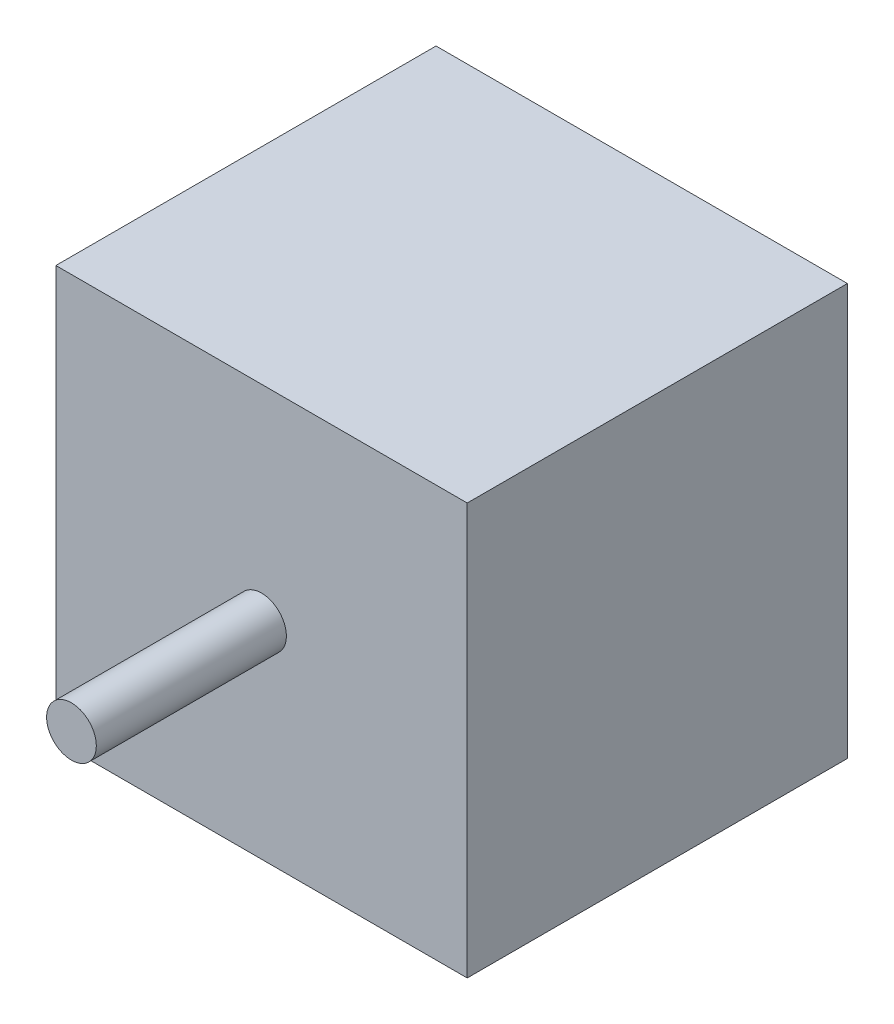
ISO-10303-21;
HEADER;
FILE_DESCRIPTION(('STEP AP214'),'2;1');
FILE_NAME('part.step','',(''),(''),'','','');
FILE_SCHEMA(('AUTOMOTIVE_DESIGN { 1 0 10303 214 1 1 1 1 }'));
ENDSEC;
DATA;
#1=APPLICATION_CONTEXT('core data for automotive mechanical design processes');
#2=APPLICATION_PROTOCOL_DEFINITION('international standard','automotive_design',2000,#1);
#3=PRODUCT_CONTEXT('',#1,'mechanical');
#4=PRODUCT('Part','Part','',(#3));
#5=PRODUCT_RELATED_PRODUCT_CATEGORY('part','',(#4));
#6=PRODUCT_DEFINITION_FORMATION('','',#4);
#7=PRODUCT_DEFINITION_CONTEXT('part definition',#1,'design');
#8=PRODUCT_DEFINITION('design','',#6,#7);
#9=PRODUCT_DEFINITION_SHAPE('','',#8);
#10=(LENGTH_UNIT() NAMED_UNIT(*) SI_UNIT(.MILLI.,.METRE.));
#11=(NAMED_UNIT(*) PLANE_ANGLE_UNIT() SI_UNIT($,.RADIAN.));
#12=(NAMED_UNIT(*) SI_UNIT($,.STERADIAN.) SOLID_ANGLE_UNIT());
#13=UNCERTAINTY_MEASURE_WITH_UNIT(LENGTH_MEASURE(1.E-05),#10,'distance_accuracy_value','');
#14=(GEOMETRIC_REPRESENTATION_CONTEXT(3) GLOBAL_UNCERTAINTY_ASSIGNED_CONTEXT((#13)) GLOBAL_UNIT_ASSIGNED_CONTEXT((#10,
#11,#12)) REPRESENTATION_CONTEXT('',''));
#15=CARTESIAN_POINT('',(0.,0.,0.));
#16=DIRECTION('',(0.,0.,1.));
#17=DIRECTION('',(1.,0.,0.));
#18=AXIS2_PLACEMENT_3D('',#15,#16,#17);
#19=CARTESIAN_POINT('',(0.,0.,39.));
#20=DIRECTION('',(-1.,0.,0.));
#21=DIRECTION('',(0.,-1.,0.));
#22=AXIS2_PLACEMENT_3D('',#19,#20,#21);
#23=PLANE('',#22);
#24=DIRECTION('',(0.,1.,0.));
#25=VECTOR('',#24,1.);
#26=CARTESIAN_POINT('',(0.,0.,0.));
#27=LINE('',#26,#25);
#28=CARTESIAN_POINT('',(0.,-42.2,0.));
#29=VERTEX_POINT('',#28);
#30=CARTESIAN_POINT('',(0.,0.,0.));
#31=VERTEX_POINT('',#30);
#32=EDGE_CURVE('E103',#29,#31,#27,.T.);
#33=ORIENTED_EDGE('',*,*,#32,.T.);
#34=DIRECTION('',(0.,0.,-1.));
#35=VECTOR('',#34,1.);
#36=CARTESIAN_POINT('',(0.,0.,39.));
#37=LINE('',#36,#35);
#38=CARTESIAN_POINT('',(0.,0.,39.));
#39=VERTEX_POINT('',#38);
#40=EDGE_CURVE('E44',#39,#31,#37,.T.);
#41=ORIENTED_EDGE('',*,*,#40,.F.);
#42=DIRECTION('',(0.,1.,0.));
#43=VECTOR('',#42,1.);
#44=CARTESIAN_POINT('',(0.,0.,39.));
#45=LINE('',#44,#43);
#46=CARTESIAN_POINT('',(0.,-42.2,39.));
#47=VERTEX_POINT('',#46);
#48=EDGE_CURVE('E88',#47,#39,#45,.T.);
#49=ORIENTED_EDGE('',*,*,#48,.F.);
#50=DIRECTION('',(0.,0.,-1.));
#51=VECTOR('',#50,1.);
#52=CARTESIAN_POINT('',(0.,-42.2,39.));
#53=LINE('',#52,#51);
#54=EDGE_CURVE('E99',#47,#29,#53,.T.);
#55=ORIENTED_EDGE('',*,*,#54,.T.);
#56=EDGE_LOOP('',(#33,#41,#49,#55));
#57=FACE_BOUND('',#56,.T.);
#58=ADVANCED_FACE('F36',(#57),#23,.F.);
#59=CARTESIAN_POINT('',(0.,0.,39.));
#60=DIRECTION('',(0.,-1.,0.));
#61=DIRECTION('',(0.,0.,-1.));
#62=AXIS2_PLACEMENT_3D('',#59,#60,#61);
#63=PLANE('',#62);
#64=DIRECTION('',(-1.,0.,0.));
#65=VECTOR('',#64,1.);
#66=CARTESIAN_POINT('',(0.,0.,0.));
#67=LINE('',#66,#65);
#68=CARTESIAN_POINT('',(-42.2,0.,0.));
#69=VERTEX_POINT('',#68);
#70=EDGE_CURVE('E94',#31,#69,#67,.T.);
#71=ORIENTED_EDGE('',*,*,#70,.T.);
#72=DIRECTION('',(0.,0.,-1.));
#73=VECTOR('',#72,1.);
#74=CARTESIAN_POINT('',(-42.2,0.,39.));
#75=LINE('',#74,#73);
#76=CARTESIAN_POINT('',(-42.2,0.,39.));
#77=VERTEX_POINT('',#76);
#78=EDGE_CURVE('E92',#77,#69,#75,.T.);
#79=ORIENTED_EDGE('',*,*,#78,.F.);
#80=DIRECTION('',(-1.,0.,0.));
#81=VECTOR('',#80,1.);
#82=CARTESIAN_POINT('',(0.,0.,39.));
#83=LINE('',#82,#81);
#84=EDGE_CURVE('E83',#39,#77,#83,.T.);
#85=ORIENTED_EDGE('',*,*,#84,.F.);
#86=ORIENTED_EDGE('',*,*,#40,.T.);
#87=EDGE_LOOP('',(#71,#79,#85,#86));
#88=FACE_BOUND('',#87,.T.);
#89=ADVANCED_FACE('F93',(#88),#63,.F.);
#90=CARTESIAN_POINT('',(-42.2,0.,39.));
#91=DIRECTION('',(1.,0.,0.));
#92=DIRECTION('',(0.,1.,0.));
#93=AXIS2_PLACEMENT_3D('',#90,#91,#92);
#94=PLANE('',#93);
#95=DIRECTION('',(0.,-1.,0.));
#96=VECTOR('',#95,1.);
#97=CARTESIAN_POINT('',(-42.2,0.,0.));
#98=LINE('',#97,#96);
#99=CARTESIAN_POINT('',(-42.2,-42.2,0.));
#100=VERTEX_POINT('',#99);
#101=EDGE_CURVE('E69',#69,#100,#98,.T.);
#102=ORIENTED_EDGE('',*,*,#101,.T.);
#103=DIRECTION('',(0.,0.,-1.));
#104=VECTOR('',#103,1.);
#105=CARTESIAN_POINT('',(-42.2,-42.2,39.));
#106=LINE('',#105,#104);
#107=CARTESIAN_POINT('',(-42.2,-42.2,39.));
#108=VERTEX_POINT('',#107);
#109=EDGE_CURVE('E95',#108,#100,#106,.T.);
#110=ORIENTED_EDGE('',*,*,#109,.F.);
#111=DIRECTION('',(0.,-1.,0.));
#112=VECTOR('',#111,1.);
#113=CARTESIAN_POINT('',(-42.2,0.,39.));
#114=LINE('',#113,#112);
#115=EDGE_CURVE('E86',#77,#108,#114,.T.);
#116=ORIENTED_EDGE('',*,*,#115,.F.);
#117=ORIENTED_EDGE('',*,*,#78,.T.);
#118=EDGE_LOOP('',(#102,#110,#116,#117));
#119=FACE_BOUND('',#118,.T.);
#120=ADVANCED_FACE('F97',(#119),#94,.F.);
#121=CARTESIAN_POINT('',(0.,-42.2,39.));
#122=DIRECTION('',(0.,1.,0.));
#123=DIRECTION('',(-1.,0.,0.));
#124=AXIS2_PLACEMENT_3D('',#121,#122,#123);
#125=PLANE('',#124);
#126=DIRECTION('',(1.,0.,0.));
#127=VECTOR('',#126,1.);
#128=CARTESIAN_POINT('',(0.,-42.2,0.));
#129=LINE('',#128,#127);
#130=EDGE_CURVE('E75',#100,#29,#129,.T.);
#131=ORIENTED_EDGE('',*,*,#130,.T.);
#132=ORIENTED_EDGE('',*,*,#54,.F.);
#133=DIRECTION('',(1.,0.,0.));
#134=VECTOR('',#133,1.);
#135=CARTESIAN_POINT('',(0.,-42.2,39.));
#136=LINE('',#135,#134);
#137=EDGE_CURVE('E52',#108,#47,#136,.T.);
#138=ORIENTED_EDGE('',*,*,#137,.F.);
#139=ORIENTED_EDGE('',*,*,#109,.T.);
#140=EDGE_LOOP('',(#131,#132,#138,#139));
#141=FACE_BOUND('',#140,.T.);
#142=ADVANCED_FACE('F127',(#141),#125,.F.);
#143=CARTESIAN_POINT('',(0.,0.,39.));
#144=DIRECTION('',(0.,0.,-1.));
#145=DIRECTION('',(-1.,0.,0.));
#146=AXIS2_PLACEMENT_3D('',#143,#144,#145);
#147=PLANE('',#146);
#148=CARTESIAN_POINT('',(-21.1,-21.1,39.));
#149=DIRECTION('',(0.,0.,-1.));
#150=DIRECTION('',(-1.,0.,0.));
#151=AXIS2_PLACEMENT_3D('',#148,#149,#150);
#152=CIRCLE('',#151,2.55);
#153=CARTESIAN_POINT('',(-23.65,-21.1,39.));
#154=VERTEX_POINT('',#153);
#155=EDGE_CURVE('E11',#154,#154,#152,.F.);
#156=ORIENTED_EDGE('',*,*,#155,.F.);
#157=EDGE_LOOP('',(#156));
#158=FACE_BOUND('',#157,.T.);
#159=ORIENTED_EDGE('',*,*,#48,.T.);
#160=ORIENTED_EDGE('',*,*,#84,.T.);
#161=ORIENTED_EDGE('',*,*,#115,.T.);
#162=ORIENTED_EDGE('',*,*,#137,.T.);
#163=EDGE_LOOP('',(#159,#160,#161,#162));
#164=FACE_BOUND('',#163,.T.);
#165=ADVANCED_FACE('F84',(#158,#164),#147,.F.);
#166=CARTESIAN_POINT('',(0.,0.,0.));
#167=DIRECTION('',(0.,0.,-1.));
#168=DIRECTION('',(-1.,0.,0.));
#169=AXIS2_PLACEMENT_3D('',#166,#167,#168);
#170=PLANE('',#169);
#171=ORIENTED_EDGE('',*,*,#32,.F.);
#172=ORIENTED_EDGE('',*,*,#130,.F.);
#173=ORIENTED_EDGE('',*,*,#101,.F.);
#174=ORIENTED_EDGE('',*,*,#70,.F.);
#175=EDGE_LOOP('',(#171,#172,#173,#174));
#176=FACE_BOUND('',#175,.T.);
#177=ADVANCED_FACE('F116',(#176),#170,.T.);
#178=CARTESIAN_POINT('',(-21.1,-21.1,58.5));
#179=DIRECTION('',(0.,0.,-1.));
#180=DIRECTION('',(-1.,0.,0.));
#181=AXIS2_PLACEMENT_3D('',#178,#179,#180);
#182=CYLINDRICAL_SURFACE('',#181,2.55);
#183=CARTESIAN_POINT('',(-21.1,-21.1,58.5));
#184=DIRECTION('',(0.,0.,1.));
#185=DIRECTION('',(1.,0.,0.));
#186=AXIS2_PLACEMENT_3D('',#183,#184,#185);
#187=CIRCLE('',#186,2.55);
#188=CARTESIAN_POINT('',(-18.55,-21.1,58.5));
#189=VERTEX_POINT('',#188);
#190=EDGE_CURVE('E106',#189,#189,#187,.T.);
#191=ORIENTED_EDGE('',*,*,#190,.F.);
#192=EDGE_LOOP('',(#191));
#193=FACE_BOUND('',#192,.T.);
#194=ORIENTED_EDGE('',*,*,#155,.T.);
#195=EDGE_LOOP('',(#194));
#196=FACE_BOUND('',#195,.T.);
#197=ADVANCED_FACE('F118',(#193,#196),#182,.T.);
#198=CARTESIAN_POINT('',(-21.1,-21.1,58.5));
#199=DIRECTION('',(0.,0.,1.));
#200=DIRECTION('',(1.,0.,0.));
#201=AXIS2_PLACEMENT_3D('',#198,#199,#200);
#202=PLANE('',#201);
#203=ORIENTED_EDGE('',*,*,#190,.T.);
#204=EDGE_LOOP('',(#203));
#205=FACE_BOUND('',#204,.T.);
#206=ADVANCED_FACE('F124',(#205),#202,.T.);
#207=CLOSED_SHELL('',(#58,#89,#120,#142,#165,#177,#197,#206));
#208=MANIFOLD_SOLID_BREP('B2',#207);
#209=ADVANCED_BREP_SHAPE_REPRESENTATION('',(#18,#208),#14);
#210=SHAPE_DEFINITION_REPRESENTATION(#9,#209);
ENDSEC;
END-ISO-10303-21;
